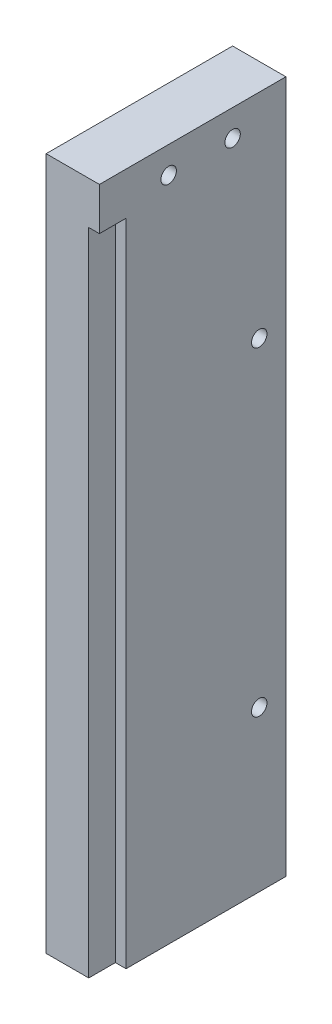
ISO-10303-21;
HEADER;
FILE_DESCRIPTION(('STEP AP214'),'2;1');
FILE_NAME('part.step','',(''),(''),'','','');
FILE_SCHEMA(('AUTOMOTIVE_DESIGN { 1 0 10303 214 1 1 1 1 }'));
ENDSEC;
DATA;
#1=APPLICATION_CONTEXT('core data for automotive mechanical design processes');
#2=APPLICATION_PROTOCOL_DEFINITION('international standard','automotive_design',2000,#1);
#3=PRODUCT_CONTEXT('',#1,'mechanical');
#4=PRODUCT('Part','Part','',(#3));
#5=PRODUCT_RELATED_PRODUCT_CATEGORY('part','',(#4));
#6=PRODUCT_DEFINITION_FORMATION('','',#4);
#7=PRODUCT_DEFINITION_CONTEXT('part definition',#1,'design');
#8=PRODUCT_DEFINITION('design','',#6,#7);
#9=PRODUCT_DEFINITION_SHAPE('','',#8);
#10=(LENGTH_UNIT() NAMED_UNIT(*) SI_UNIT(.MILLI.,.METRE.));
#11=(NAMED_UNIT(*) PLANE_ANGLE_UNIT() SI_UNIT($,.RADIAN.));
#12=(NAMED_UNIT(*) SI_UNIT($,.STERADIAN.) SOLID_ANGLE_UNIT());
#13=UNCERTAINTY_MEASURE_WITH_UNIT(LENGTH_MEASURE(1.E-05),#10,'distance_accuracy_value','');
#14=(GEOMETRIC_REPRESENTATION_CONTEXT(3) GLOBAL_UNCERTAINTY_ASSIGNED_CONTEXT((#13)) GLOBAL_UNIT_ASSIGNED_CONTEXT((#10,
#11,#12)) REPRESENTATION_CONTEXT('',''));
#15=CARTESIAN_POINT('',(0.,0.,0.));
#16=DIRECTION('',(0.,0.,1.));
#17=DIRECTION('',(1.,0.,0.));
#18=AXIS2_PLACEMENT_3D('',#15,#16,#17);
#19=CARTESIAN_POINT('',(-86.0171548528881,-65.3289844851904,-147.484048104053));
#20=DIRECTION('',(0.,-1.,0.));
#21=DIRECTION('',(0.,0.,-1.));
#22=AXIS2_PLACEMENT_3D('',#19,#20,#21);
#23=PLANE('',#22);
#24=CARTESIAN_POINT('',(-81.0171548528881,-65.3289844851904,4.90000000000004));
#25=DIRECTION('',(0.,-1.,0.));
#26=DIRECTION('',(0.,0.,-1.));
#27=AXIS2_PLACEMENT_3D('',#24,#25,#26);
#28=CIRCLE('',#27,2.1);
#29=CARTESIAN_POINT('',(-81.0171548528881,-65.3289844851904,2.80000000000004));
#30=VERTEX_POINT('',#29);
#31=EDGE_CURVE('E238',#30,#30,#28,.T.);
#32=ORIENTED_EDGE('',*,*,#31,.F.);
#33=EDGE_LOOP('',(#32));
#34=FACE_BOUND('',#33,.T.);
#35=CARTESIAN_POINT('',(-81.0171548528881,-65.3289844851904,-7.09999999999996));
#36=DIRECTION('',(0.,-1.,0.));
#37=DIRECTION('',(0.,0.,-1.));
#38=AXIS2_PLACEMENT_3D('',#35,#36,#37);
#39=CIRCLE('',#38,2.1);
#40=CARTESIAN_POINT('',(-81.0171548528881,-65.3289844851904,-9.19999999999997));
#41=VERTEX_POINT('',#40);
#42=EDGE_CURVE('E250',#41,#41,#39,.T.);
#43=ORIENTED_EDGE('',*,*,#42,.F.);
#44=EDGE_LOOP('',(#43));
#45=FACE_BOUND('',#44,.T.);
#46=DIRECTION('',(0.,0.,1.));
#47=VECTOR('',#46,1.);
#48=CARTESIAN_POINT('',(-76.0171548528881,-65.3289844851904,-147.484048104053));
#49=LINE('',#48,#47);
#50=CARTESIAN_POINT('',(-76.0171548528881,-65.3289844851904,-17.0999999999999));
#51=VERTEX_POINT('',#50);
#52=CARTESIAN_POINT('',(-76.0171548528881,-65.3289844851904,12.9));
#53=VERTEX_POINT('',#52);
#54=EDGE_CURVE('E186',#51,#53,#49,.T.);
#55=ORIENTED_EDGE('',*,*,#54,.T.);
#56=DIRECTION('',(-1.,0.,0.));
#57=VECTOR('',#56,1.);
#58=CARTESIAN_POINT('',(-86.0171548528881,-65.3289844851904,12.9));
#59=LINE('',#58,#57);
#60=CARTESIAN_POINT('',(-78.0171548528881,-65.3289844851904,12.9));
#61=VERTEX_POINT('',#60);
#62=EDGE_CURVE('E197',#53,#61,#59,.T.);
#63=ORIENTED_EDGE('',*,*,#62,.T.);
#64=DIRECTION('',(0.,0.,1.));
#65=VECTOR('',#64,1.);
#66=CARTESIAN_POINT('',(-78.0171548528881,-65.3289844851904,-147.484048104053));
#67=LINE('',#66,#65);
#68=CARTESIAN_POINT('',(-78.0171548528881,-65.3289844851904,17.9));
#69=VERTEX_POINT('',#68);
#70=EDGE_CURVE('E147',#61,#69,#67,.T.);
#71=ORIENTED_EDGE('',*,*,#70,.T.);
#72=DIRECTION('',(1.,0.,0.));
#73=VECTOR('',#72,1.);
#74=CARTESIAN_POINT('',(-86.0171548528881,-65.3289844851904,17.9));
#75=LINE('',#74,#73);
#76=CARTESIAN_POINT('',(-86.0171548528881,-65.3289844851904,17.9));
#77=VERTEX_POINT('',#76);
#78=EDGE_CURVE('E168',#77,#69,#75,.T.);
#79=ORIENTED_EDGE('',*,*,#78,.F.);
#80=DIRECTION('',(0.,0.,1.));
#81=VECTOR('',#80,1.);
#82=CARTESIAN_POINT('',(-86.0171548528881,-65.3289844851904,-147.484048104053));
#83=LINE('',#82,#81);
#84=CARTESIAN_POINT('',(-86.0171548528881,-65.3289844851904,-17.0999999999999));
#85=VERTEX_POINT('',#84);
#86=EDGE_CURVE('E179',#85,#77,#83,.T.);
#87=ORIENTED_EDGE('',*,*,#86,.F.);
#88=DIRECTION('',(-1.,0.,0.));
#89=VECTOR('',#88,1.);
#90=CARTESIAN_POINT('',(-86.0171548528881,-65.3289844851904,-17.0999999999999));
#91=LINE('',#90,#89);
#92=EDGE_CURVE('E164',#51,#85,#91,.T.);
#93=ORIENTED_EDGE('',*,*,#92,.F.);
#94=EDGE_LOOP('',(#55,#63,#71,#79,#87,#93));
#95=FACE_BOUND('',#94,.T.);
#96=ADVANCED_FACE('F41',(#34,#45,#95),#23,.T.);
#97=CARTESIAN_POINT('',(-86.0171548528881,64.6710155148096,-147.484048104053));
#98=DIRECTION('',(-1.,0.,0.));
#99=DIRECTION('',(0.,-1.,0.));
#100=AXIS2_PLACEMENT_3D('',#97,#98,#99);
#101=PLANE('',#100);
#102=CARTESIAN_POINT('',(-86.0171548528881,59.6710155148096,-7.09999999999996));
#103=DIRECTION('',(-1.,0.,0.));
#104=DIRECTION('',(0.,-1.,0.));
#105=AXIS2_PLACEMENT_3D('',#102,#103,#104);
#106=CIRCLE('',#105,2.475);
#107=CARTESIAN_POINT('',(-86.0171548528881,57.1960155148096,-7.09999999999996));
#108=VERTEX_POINT('',#107);
#109=EDGE_CURVE('E11',#108,#108,#106,.T.);
#110=ORIENTED_EDGE('',*,*,#109,.F.);
#111=EDGE_LOOP('',(#110));
#112=FACE_BOUND('',#111,.T.);
#113=CARTESIAN_POINT('',(-86.0171548528881,59.6710155148096,4.90000000000004));
#114=DIRECTION('',(-1.,0.,0.));
#115=DIRECTION('',(0.,-1.,0.));
#116=AXIS2_PLACEMENT_3D('',#113,#114,#115);
#117=CIRCLE('',#116,2.475);
#118=CARTESIAN_POINT('',(-86.0171548528881,57.1960155148096,4.90000000000004));
#119=VERTEX_POINT('',#118);
#120=EDGE_CURVE('E51',#119,#119,#117,.T.);
#121=ORIENTED_EDGE('',*,*,#120,.F.);
#122=EDGE_LOOP('',(#121));
#123=FACE_BOUND('',#122,.T.);
#124=CARTESIAN_POINT('',(-86.0171548528881,-35.3289844851904,-12.1));
#125=DIRECTION('',(-1.,0.,0.));
#126=DIRECTION('',(0.,-1.,0.));
#127=AXIS2_PLACEMENT_3D('',#124,#125,#126);
#128=CIRCLE('',#127,2.475);
#129=CARTESIAN_POINT('',(-86.0171548528881,-37.8039844851904,-12.1));
#130=VERTEX_POINT('',#129);
#131=EDGE_CURVE('E221',#130,#130,#128,.T.);
#132=ORIENTED_EDGE('',*,*,#131,.F.);
#133=EDGE_LOOP('',(#132));
#134=FACE_BOUND('',#133,.T.);
#135=CARTESIAN_POINT('',(-86.0171548528881,24.6710155148096,-12.1));
#136=DIRECTION('',(-1.,0.,0.));
#137=DIRECTION('',(0.,-1.,0.));
#138=AXIS2_PLACEMENT_3D('',#135,#136,#137);
#139=CIRCLE('',#138,2.475);
#140=CARTESIAN_POINT('',(-86.0171548528881,22.1960155148096,-12.1));
#141=VERTEX_POINT('',#140);
#142=EDGE_CURVE('E217',#141,#141,#139,.T.);
#143=ORIENTED_EDGE('',*,*,#142,.F.);
#144=EDGE_LOOP('',(#143));
#145=FACE_BOUND('',#144,.T.);
#146=DIRECTION('',(0.,1.,0.));
#147=VECTOR('',#146,1.);
#148=CARTESIAN_POINT('',(-86.0171548528881,64.6710155148096,-17.0999999999999));
#149=LINE('',#148,#147);
#150=CARTESIAN_POINT('',(-86.0171548528881,64.6710155148096,-17.0999999999999));
#151=VERTEX_POINT('',#150);
#152=EDGE_CURVE('E161',#85,#151,#149,.T.);
#153=ORIENTED_EDGE('',*,*,#152,.F.);
#154=ORIENTED_EDGE('',*,*,#86,.T.);
#155=DIRECTION('',(0.,-1.,0.));
#156=VECTOR('',#155,1.);
#157=CARTESIAN_POINT('',(-86.0171548528881,64.6710155148096,17.9));
#158=LINE('',#157,#156);
#159=CARTESIAN_POINT('',(-86.0171548528881,64.6710155148096,17.9));
#160=VERTEX_POINT('',#159);
#161=EDGE_CURVE('E154',#160,#77,#158,.T.);
#162=ORIENTED_EDGE('',*,*,#161,.F.);
#163=DIRECTION('',(0.,0.,1.));
#164=VECTOR('',#163,1.);
#165=CARTESIAN_POINT('',(-86.0171548528881,64.6710155148096,-147.484048104053));
#166=LINE('',#165,#164);
#167=EDGE_CURVE('E158',#151,#160,#166,.T.);
#168=ORIENTED_EDGE('',*,*,#167,.F.);
#169=EDGE_LOOP('',(#153,#154,#162,#168));
#170=FACE_BOUND('',#169,.T.);
#171=ADVANCED_FACE('F43',(#112,#123,#134,#145,#170),#101,.T.);
#172=CARTESIAN_POINT('',(-86.0171548528881,64.6710155148096,-147.484048104053));
#173=DIRECTION('',(0.,1.,0.));
#174=DIRECTION('',(0.,0.,1.));
#175=AXIS2_PLACEMENT_3D('',#172,#173,#174);
#176=PLANE('',#175);
#177=DIRECTION('',(1.,0.,0.));
#178=VECTOR('',#177,1.);
#179=CARTESIAN_POINT('',(-86.0171548528881,64.6710155148096,-17.0999999999999));
#180=LINE('',#179,#178);
#181=CARTESIAN_POINT('',(-76.0171548528881,64.6710155148096,-17.0999999999999));
#182=VERTEX_POINT('',#181);
#183=EDGE_CURVE('E68',#151,#182,#180,.T.);
#184=ORIENTED_EDGE('',*,*,#183,.F.);
#185=ORIENTED_EDGE('',*,*,#167,.T.);
#186=DIRECTION('',(-1.,0.,0.));
#187=VECTOR('',#186,1.);
#188=CARTESIAN_POINT('',(-86.0171548528881,64.6710155148096,17.9));
#189=LINE('',#188,#187);
#190=CARTESIAN_POINT('',(-76.0171548528881,64.6710155148096,17.9));
#191=VERTEX_POINT('',#190);
#192=EDGE_CURVE('E175',#191,#160,#189,.T.);
#193=ORIENTED_EDGE('',*,*,#192,.F.);
#194=DIRECTION('',(0.,0.,1.));
#195=VECTOR('',#194,1.);
#196=CARTESIAN_POINT('',(-76.0171548528881,64.6710155148096,-147.484048104053));
#197=LINE('',#196,#195);
#198=EDGE_CURVE('E182',#182,#191,#197,.T.);
#199=ORIENTED_EDGE('',*,*,#198,.F.);
#200=EDGE_LOOP('',(#184,#185,#193,#199));
#201=FACE_BOUND('',#200,.T.);
#202=ADVANCED_FACE('F291',(#201),#176,.T.);
#203=CARTESIAN_POINT('',(-76.0171548528881,64.6710155148096,-147.484048104053));
#204=DIRECTION('',(1.,0.,0.));
#205=DIRECTION('',(0.,1.,0.));
#206=AXIS2_PLACEMENT_3D('',#203,#204,#205);
#207=PLANE('',#206);
#208=DIRECTION('',(0.,-1.,0.));
#209=VECTOR('',#208,1.);
#210=CARTESIAN_POINT('',(-76.0171548528881,64.6710155148096,12.9));
#211=LINE('',#210,#209);
#212=CARTESIAN_POINT('',(-76.0171548528881,56.6710155148096,12.9));
#213=VERTEX_POINT('',#212);
#214=EDGE_CURVE('E151',#213,#53,#211,.T.);
#215=ORIENTED_EDGE('',*,*,#214,.T.);
#216=ORIENTED_EDGE('',*,*,#54,.F.);
#217=DIRECTION('',(0.,-1.,0.));
#218=VECTOR('',#217,1.);
#219=CARTESIAN_POINT('',(-76.0171548528881,64.6710155148096,-17.0999999999999));
#220=LINE('',#219,#218);
#221=EDGE_CURVE('E155',#182,#51,#220,.T.);
#222=ORIENTED_EDGE('',*,*,#221,.F.);
#223=ORIENTED_EDGE('',*,*,#198,.T.);
#224=DIRECTION('',(0.,1.,0.));
#225=VECTOR('',#224,1.);
#226=CARTESIAN_POINT('',(-76.0171548528881,64.6710155148096,17.9));
#227=LINE('',#226,#225);
#228=CARTESIAN_POINT('',(-76.0171548528881,56.6710155148096,17.9));
#229=VERTEX_POINT('',#228);
#230=EDGE_CURVE('E172',#229,#191,#227,.T.);
#231=ORIENTED_EDGE('',*,*,#230,.F.);
#232=DIRECTION('',(0.,0.,-1.));
#233=VECTOR('',#232,1.);
#234=CARTESIAN_POINT('',(-76.0171548528881,56.6710155148096,-147.484048104053));
#235=LINE('',#234,#233);
#236=EDGE_CURVE('E59',#229,#213,#235,.T.);
#237=ORIENTED_EDGE('',*,*,#236,.T.);
#238=EDGE_LOOP('',(#215,#216,#222,#223,#231,#237));
#239=FACE_BOUND('',#238,.T.);
#240=CARTESIAN_POINT('',(-76.0171548528881,59.6710155148096,-7.09999999999996));
#241=DIRECTION('',(1.,0.,0.));
#242=DIRECTION('',(0.,1.,0.));
#243=AXIS2_PLACEMENT_3D('',#240,#241,#242);
#244=CIRCLE('',#243,1.44999999999999);
#245=CARTESIAN_POINT('',(-76.0171548528881,61.1210155148096,-7.09999999999996));
#246=VERTEX_POINT('',#245);
#247=EDGE_CURVE('E213',#246,#246,#244,.T.);
#248=ORIENTED_EDGE('',*,*,#247,.F.);
#249=EDGE_LOOP('',(#248));
#250=FACE_BOUND('',#249,.T.);
#251=CARTESIAN_POINT('',(-76.0171548528881,59.6710155148096,4.90000000000004));
#252=DIRECTION('',(1.,0.,0.));
#253=DIRECTION('',(0.,1.,0.));
#254=AXIS2_PLACEMENT_3D('',#251,#252,#253);
#255=CIRCLE('',#254,1.44999999999999);
#256=CARTESIAN_POINT('',(-76.0171548528881,61.1210155148096,4.90000000000004));
#257=VERTEX_POINT('',#256);
#258=EDGE_CURVE('E209',#257,#257,#255,.T.);
#259=ORIENTED_EDGE('',*,*,#258,.F.);
#260=EDGE_LOOP('',(#259));
#261=FACE_BOUND('',#260,.T.);
#262=CARTESIAN_POINT('',(-76.0171548528881,-35.3289844851904,-12.1));
#263=DIRECTION('',(1.,0.,0.));
#264=DIRECTION('',(0.,1.,0.));
#265=AXIS2_PLACEMENT_3D('',#262,#263,#264);
#266=CIRCLE('',#265,1.45);
#267=CARTESIAN_POINT('',(-76.0171548528881,-33.8789844851904,-12.1));
#268=VERTEX_POINT('',#267);
#269=EDGE_CURVE('E205',#268,#268,#266,.T.);
#270=ORIENTED_EDGE('',*,*,#269,.F.);
#271=EDGE_LOOP('',(#270));
#272=FACE_BOUND('',#271,.T.);
#273=CARTESIAN_POINT('',(-76.0171548528881,24.6710155148096,-12.1));
#274=DIRECTION('',(1.,0.,0.));
#275=DIRECTION('',(0.,1.,0.));
#276=AXIS2_PLACEMENT_3D('',#273,#274,#275);
#277=CIRCLE('',#276,1.45);
#278=CARTESIAN_POINT('',(-76.0171548528881,26.1210155148096,-12.1));
#279=VERTEX_POINT('',#278);
#280=EDGE_CURVE('E201',#279,#279,#277,.T.);
#281=ORIENTED_EDGE('',*,*,#280,.F.);
#282=EDGE_LOOP('',(#281));
#283=FACE_BOUND('',#282,.T.);
#284=ADVANCED_FACE('F313',(#239,#250,#261,#272,#283),#207,.T.);
#285=CARTESIAN_POINT('',(0.,0.,17.9));
#286=DIRECTION('',(0.,0.,1.));
#287=DIRECTION('',(1.,0.,0.));
#288=AXIS2_PLACEMENT_3D('',#285,#286,#287);
#289=PLANE('',#288);
#290=ORIENTED_EDGE('',*,*,#78,.T.);
#291=DIRECTION('',(0.,-1.,0.));
#292=VECTOR('',#291,1.);
#293=CARTESIAN_POINT('',(-78.0171548528881,56.6710155148096,17.9));
#294=LINE('',#293,#292);
#295=CARTESIAN_POINT('',(-78.0171548528881,56.6710155148096,17.9));
#296=VERTEX_POINT('',#295);
#297=EDGE_CURVE('E132',#296,#69,#294,.T.);
#298=ORIENTED_EDGE('',*,*,#297,.F.);
#299=DIRECTION('',(1.,0.,0.));
#300=VECTOR('',#299,1.);
#301=CARTESIAN_POINT('',(0.,56.6710155148096,17.9));
#302=LINE('',#301,#300);
#303=EDGE_CURVE('E194',#296,#229,#302,.T.);
#304=ORIENTED_EDGE('',*,*,#303,.T.);
#305=ORIENTED_EDGE('',*,*,#230,.T.);
#306=ORIENTED_EDGE('',*,*,#192,.T.);
#307=ORIENTED_EDGE('',*,*,#161,.T.);
#308=EDGE_LOOP('',(#290,#298,#304,#305,#306,#307));
#309=FACE_BOUND('',#308,.T.);
#310=ADVANCED_FACE('F307',(#309),#289,.T.);
#311=CARTESIAN_POINT('',(-16.0171548528881,-5.32898448519041,-17.1));
#312=DIRECTION('',(0.,0.,1.));
#313=DIRECTION('',(1.,0.,0.));
#314=AXIS2_PLACEMENT_3D('',#311,#312,#313);
#315=PLANE('',#314);
#316=ORIENTED_EDGE('',*,*,#152,.T.);
#317=ORIENTED_EDGE('',*,*,#183,.T.);
#318=ORIENTED_EDGE('',*,*,#221,.T.);
#319=ORIENTED_EDGE('',*,*,#92,.T.);
#320=EDGE_LOOP('',(#316,#317,#318,#319));
#321=FACE_BOUND('',#320,.T.);
#322=ADVANCED_FACE('F316',(#321),#315,.F.);
#323=CARTESIAN_POINT('',(-78.0171548528881,56.6710155148096,17.9));
#324=DIRECTION('',(0.,-1.,0.));
#325=DIRECTION('',(1.,0.,0.));
#326=AXIS2_PLACEMENT_3D('',#323,#324,#325);
#327=PLANE('',#326);
#328=ORIENTED_EDGE('',*,*,#236,.F.);
#329=ORIENTED_EDGE('',*,*,#303,.F.);
#330=DIRECTION('',(0.,0.,-1.));
#331=VECTOR('',#330,1.);
#332=CARTESIAN_POINT('',(-78.0171548528881,56.6710155148096,17.9));
#333=LINE('',#332,#331);
#334=CARTESIAN_POINT('',(-78.0171548528881,56.6710155148096,12.9));
#335=VERTEX_POINT('',#334);
#336=EDGE_CURVE('E135',#296,#335,#333,.T.);
#337=ORIENTED_EDGE('',*,*,#336,.T.);
#338=DIRECTION('',(-1.,0.,0.));
#339=VECTOR('',#338,1.);
#340=CARTESIAN_POINT('',(-78.0171548528881,56.6710155148096,12.9));
#341=LINE('',#340,#339);
#342=EDGE_CURVE('E136',#213,#335,#341,.T.);
#343=ORIENTED_EDGE('',*,*,#342,.F.);
#344=EDGE_LOOP('',(#328,#329,#337,#343));
#345=FACE_BOUND('',#344,.T.);
#346=ADVANCED_FACE('F318',(#345),#327,.T.);
#347=CARTESIAN_POINT('',(-78.0171548528881,56.6710155148096,17.9));
#348=DIRECTION('',(1.,0.,0.));
#349=DIRECTION('',(0.,0.,-1.));
#350=AXIS2_PLACEMENT_3D('',#347,#348,#349);
#351=PLANE('',#350);
#352=ORIENTED_EDGE('',*,*,#70,.F.);
#353=DIRECTION('',(0.,-1.,0.));
#354=VECTOR('',#353,1.);
#355=CARTESIAN_POINT('',(-78.0171548528881,56.6710155148096,12.9));
#356=LINE('',#355,#354);
#357=EDGE_CURVE('E125',#335,#61,#356,.T.);
#358=ORIENTED_EDGE('',*,*,#357,.F.);
#359=ORIENTED_EDGE('',*,*,#336,.F.);
#360=ORIENTED_EDGE('',*,*,#297,.T.);
#361=EDGE_LOOP('',(#352,#358,#359,#360));
#362=FACE_BOUND('',#361,.T.);
#363=ADVANCED_FACE('F325',(#362),#351,.T.);
#364=CARTESIAN_POINT('',(-16.0171548528881,-5.32898448519041,12.9));
#365=DIRECTION('',(0.,0.,1.));
#366=DIRECTION('',(1.,0.,0.));
#367=AXIS2_PLACEMENT_3D('',#364,#365,#366);
#368=PLANE('',#367);
#369=ORIENTED_EDGE('',*,*,#214,.F.);
#370=ORIENTED_EDGE('',*,*,#342,.T.);
#371=ORIENTED_EDGE('',*,*,#357,.T.);
#372=ORIENTED_EDGE('',*,*,#62,.F.);
#373=EDGE_LOOP('',(#369,#370,#371,#372));
#374=FACE_BOUND('',#373,.T.);
#375=ADVANCED_FACE('F363',(#374),#368,.T.);
#376=CARTESIAN_POINT('',(-86.0171548528881,24.6710155148096,-12.1));
#377=DIRECTION('',(-1.,0.,0.));
#378=DIRECTION('',(0.,0.,1.));
#379=AXIS2_PLACEMENT_3D('',#376,#377,#378);
#380=CYLINDRICAL_SURFACE('',#379,2.475);
#381=CARTESIAN_POINT('',(-84.1171548528881,24.6710155148096,-12.1));
#382=DIRECTION('',(-1.,0.,0.));
#383=DIRECTION('',(0.,0.,1.));
#384=AXIS2_PLACEMENT_3D('',#381,#382,#383);
#385=CIRCLE('',#384,2.475);
#386=CARTESIAN_POINT('',(-84.1171548528881,24.6710155148096,-9.62499999999996));
#387=VERTEX_POINT('',#386);
#388=EDGE_CURVE('E236',#387,#387,#385,.T.);
#389=ORIENTED_EDGE('',*,*,#388,.F.);
#390=EDGE_LOOP('',(#389));
#391=FACE_BOUND('',#390,.T.);
#392=ORIENTED_EDGE('',*,*,#142,.T.);
#393=EDGE_LOOP('',(#392));
#394=FACE_BOUND('',#393,.T.);
#395=ADVANCED_FACE('F369',(#391,#394),#380,.F.);
#396=CARTESIAN_POINT('',(-84.1171548528881,26.1210155148096,-12.1));
#397=DIRECTION('',(1.,0.,0.));
#398=DIRECTION('',(0.,0.,-1.));
#399=AXIS2_PLACEMENT_3D('',#396,#397,#398);
#400=PLANE('',#399);
#401=CARTESIAN_POINT('',(-84.1171548528881,24.6710155148096,-12.1));
#402=DIRECTION('',(-1.,0.,0.));
#403=DIRECTION('',(0.,0.,1.));
#404=AXIS2_PLACEMENT_3D('',#401,#402,#403);
#405=CIRCLE('',#404,1.45);
#406=CARTESIAN_POINT('',(-84.1171548528881,24.6710155148096,-10.65));
#407=VERTEX_POINT('',#406);
#408=EDGE_CURVE('E257',#407,#407,#405,.T.);
#409=ORIENTED_EDGE('',*,*,#408,.F.);
#410=EDGE_LOOP('',(#409));
#411=FACE_BOUND('',#410,.T.);
#412=ORIENTED_EDGE('',*,*,#388,.T.);
#413=EDGE_LOOP('',(#412));
#414=FACE_BOUND('',#413,.T.);
#415=ADVANCED_FACE('F387',(#411,#414),#400,.F.);
#416=CARTESIAN_POINT('',(-86.0171548528881,24.6710155148096,-12.1));
#417=DIRECTION('',(-1.,0.,0.));
#418=DIRECTION('',(0.,0.,1.));
#419=AXIS2_PLACEMENT_3D('',#416,#417,#418);
#420=CYLINDRICAL_SURFACE('',#419,1.45);
#421=ORIENTED_EDGE('',*,*,#280,.T.);
#422=EDGE_LOOP('',(#421));
#423=FACE_BOUND('',#422,.T.);
#424=ORIENTED_EDGE('',*,*,#408,.T.);
#425=EDGE_LOOP('',(#424));
#426=FACE_BOUND('',#425,.T.);
#427=ADVANCED_FACE('F394',(#423,#426),#420,.F.);
#428=CARTESIAN_POINT('',(-86.0171548528881,-35.3289844851904,-12.1));
#429=DIRECTION('',(-1.,0.,0.));
#430=DIRECTION('',(0.,0.,1.));
#431=AXIS2_PLACEMENT_3D('',#428,#429,#430);
#432=CYLINDRICAL_SURFACE('',#431,2.475);
#433=CARTESIAN_POINT('',(-84.1171548528881,-35.3289844851904,-12.1));
#434=DIRECTION('',(-1.,0.,0.));
#435=DIRECTION('',(0.,0.,1.));
#436=AXIS2_PLACEMENT_3D('',#433,#434,#435);
#437=CIRCLE('',#436,2.475);
#438=CARTESIAN_POINT('',(-84.1171548528881,-35.3289844851904,-9.62499999999996));
#439=VERTEX_POINT('',#438);
#440=EDGE_CURVE('E261',#439,#439,#437,.T.);
#441=ORIENTED_EDGE('',*,*,#440,.F.);
#442=EDGE_LOOP('',(#441));
#443=FACE_BOUND('',#442,.T.);
#444=ORIENTED_EDGE('',*,*,#131,.T.);
#445=EDGE_LOOP('',(#444));
#446=FACE_BOUND('',#445,.T.);
#447=ADVANCED_FACE('F401',(#443,#446),#432,.F.);
#448=CARTESIAN_POINT('',(-84.1171548528881,-33.8789844851904,-12.1));
#449=DIRECTION('',(1.,0.,0.));
#450=DIRECTION('',(0.,0.,-1.));
#451=AXIS2_PLACEMENT_3D('',#448,#449,#450);
#452=PLANE('',#451);
#453=CARTESIAN_POINT('',(-84.1171548528881,-35.3289844851904,-12.1));
#454=DIRECTION('',(-1.,0.,0.));
#455=DIRECTION('',(0.,0.,1.));
#456=AXIS2_PLACEMENT_3D('',#453,#454,#455);
#457=CIRCLE('',#456,1.45);
#458=CARTESIAN_POINT('',(-84.1171548528881,-35.3289844851904,-10.65));
#459=VERTEX_POINT('',#458);
#460=EDGE_CURVE('E265',#459,#459,#457,.T.);
#461=ORIENTED_EDGE('',*,*,#460,.F.);
#462=EDGE_LOOP('',(#461));
#463=FACE_BOUND('',#462,.T.);
#464=ORIENTED_EDGE('',*,*,#440,.T.);
#465=EDGE_LOOP('',(#464));
#466=FACE_BOUND('',#465,.T.);
#467=ADVANCED_FACE('F408',(#463,#466),#452,.F.);
#468=CARTESIAN_POINT('',(-86.0171548528881,-35.3289844851904,-12.1));
#469=DIRECTION('',(-1.,0.,0.));
#470=DIRECTION('',(0.,0.,1.));
#471=AXIS2_PLACEMENT_3D('',#468,#469,#470);
#472=CYLINDRICAL_SURFACE('',#471,1.45);
#473=ORIENTED_EDGE('',*,*,#269,.T.);
#474=EDGE_LOOP('',(#473));
#475=FACE_BOUND('',#474,.T.);
#476=ORIENTED_EDGE('',*,*,#460,.T.);
#477=EDGE_LOOP('',(#476));
#478=FACE_BOUND('',#477,.T.);
#479=ADVANCED_FACE('F415',(#475,#478),#472,.F.);
#480=CARTESIAN_POINT('',(-86.0171548528881,59.6710155148096,4.90000000000004));
#481=DIRECTION('',(-1.,0.,0.));
#482=DIRECTION('',(0.,0.,1.));
#483=AXIS2_PLACEMENT_3D('',#480,#481,#482);
#484=CYLINDRICAL_SURFACE('',#483,2.475);
#485=CARTESIAN_POINT('',(-84.1171548528881,59.6710155148096,4.90000000000004));
#486=DIRECTION('',(-1.,0.,0.));
#487=DIRECTION('',(0.,0.,1.));
#488=AXIS2_PLACEMENT_3D('',#485,#486,#487);
#489=CIRCLE('',#488,2.475);
#490=CARTESIAN_POINT('',(-84.1171548528881,59.6710155148096,7.37500000000005));
#491=VERTEX_POINT('',#490);
#492=EDGE_CURVE('E269',#491,#491,#489,.T.);
#493=ORIENTED_EDGE('',*,*,#492,.F.);
#494=EDGE_LOOP('',(#493));
#495=FACE_BOUND('',#494,.T.);
#496=ORIENTED_EDGE('',*,*,#120,.T.);
#497=EDGE_LOOP('',(#496));
#498=FACE_BOUND('',#497,.T.);
#499=ADVANCED_FACE('F422',(#495,#498),#484,.F.);
#500=CARTESIAN_POINT('',(-84.1171548528881,61.1210155148096,4.90000000000004));
#501=DIRECTION('',(1.,0.,0.));
#502=DIRECTION('',(0.,0.,-1.));
#503=AXIS2_PLACEMENT_3D('',#500,#501,#502);
#504=PLANE('',#503);
#505=CARTESIAN_POINT('',(-84.1171548528881,59.6710155148096,4.90000000000004));
#506=DIRECTION('',(-1.,0.,0.));
#507=DIRECTION('',(0.,0.,1.));
#508=AXIS2_PLACEMENT_3D('',#505,#506,#507);
#509=CIRCLE('',#508,1.44999999999999);
#510=CARTESIAN_POINT('',(-84.1171548528881,59.6710155148096,6.35000000000003));
#511=VERTEX_POINT('',#510);
#512=EDGE_CURVE('E273',#511,#511,#509,.T.);
#513=ORIENTED_EDGE('',*,*,#512,.F.);
#514=EDGE_LOOP('',(#513));
#515=FACE_BOUND('',#514,.T.);
#516=ORIENTED_EDGE('',*,*,#492,.T.);
#517=EDGE_LOOP('',(#516));
#518=FACE_BOUND('',#517,.T.);
#519=ADVANCED_FACE('F429',(#515,#518),#504,.F.);
#520=CARTESIAN_POINT('',(-86.0171548528881,59.6710155148096,4.90000000000004));
#521=DIRECTION('',(-1.,0.,0.));
#522=DIRECTION('',(0.,0.,1.));
#523=AXIS2_PLACEMENT_3D('',#520,#521,#522);
#524=CYLINDRICAL_SURFACE('',#523,1.44999999999999);
#525=ORIENTED_EDGE('',*,*,#258,.T.);
#526=EDGE_LOOP('',(#525));
#527=FACE_BOUND('',#526,.T.);
#528=ORIENTED_EDGE('',*,*,#512,.T.);
#529=EDGE_LOOP('',(#528));
#530=FACE_BOUND('',#529,.T.);
#531=ADVANCED_FACE('F436',(#527,#530),#524,.F.);
#532=CARTESIAN_POINT('',(-86.0171548528881,59.6710155148096,-7.09999999999996));
#533=DIRECTION('',(-1.,0.,0.));
#534=DIRECTION('',(0.,0.,1.));
#535=AXIS2_PLACEMENT_3D('',#532,#533,#534);
#536=CYLINDRICAL_SURFACE('',#535,1.44999999999999);
#537=ORIENTED_EDGE('',*,*,#247,.T.);
#538=EDGE_LOOP('',(#537));
#539=FACE_BOUND('',#538,.T.);
#540=CARTESIAN_POINT('',(-84.1171548528881,59.6710155148096,-7.09999999999996));
#541=DIRECTION('',(-1.,0.,0.));
#542=DIRECTION('',(0.,0.,1.));
#543=AXIS2_PLACEMENT_3D('',#540,#541,#542);
#544=CIRCLE('',#543,1.44999999999999);
#545=CARTESIAN_POINT('',(-84.1171548528881,59.6710155148096,-5.64999999999997));
#546=VERTEX_POINT('',#545);
#547=EDGE_CURVE('E120',#546,#546,#544,.T.);
#548=ORIENTED_EDGE('',*,*,#547,.T.);
#549=EDGE_LOOP('',(#548));
#550=FACE_BOUND('',#549,.T.);
#551=ADVANCED_FACE('F443',(#539,#550),#536,.F.);
#552=CARTESIAN_POINT('',(-84.1171548528881,61.1210155148096,-7.09999999999996));
#553=DIRECTION('',(1.,0.,0.));
#554=DIRECTION('',(0.,0.,-1.));
#555=AXIS2_PLACEMENT_3D('',#552,#553,#554);
#556=PLANE('',#555);
#557=ORIENTED_EDGE('',*,*,#547,.F.);
#558=EDGE_LOOP('',(#557));
#559=FACE_BOUND('',#558,.T.);
#560=CARTESIAN_POINT('',(-84.1171548528881,59.6710155148096,-7.09999999999996));
#561=DIRECTION('',(-1.,0.,0.));
#562=DIRECTION('',(0.,0.,1.));
#563=AXIS2_PLACEMENT_3D('',#560,#561,#562);
#564=CIRCLE('',#563,2.475);
#565=CARTESIAN_POINT('',(-84.1171548528881,59.6710155148096,-4.62499999999995));
#566=VERTEX_POINT('',#565);
#567=EDGE_CURVE('E128',#566,#566,#564,.T.);
#568=ORIENTED_EDGE('',*,*,#567,.T.);
#569=EDGE_LOOP('',(#568));
#570=FACE_BOUND('',#569,.T.);
#571=ADVANCED_FACE('F280',(#559,#570),#556,.F.);
#572=CARTESIAN_POINT('',(-86.0171548528881,59.6710155148096,-7.09999999999996));
#573=DIRECTION('',(-1.,0.,0.));
#574=DIRECTION('',(0.,0.,1.));
#575=AXIS2_PLACEMENT_3D('',#572,#573,#574);
#576=CYLINDRICAL_SURFACE('',#575,2.475);
#577=ORIENTED_EDGE('',*,*,#567,.F.);
#578=EDGE_LOOP('',(#577));
#579=FACE_BOUND('',#578,.T.);
#580=ORIENTED_EDGE('',*,*,#109,.T.);
#581=EDGE_LOOP('',(#580));
#582=FACE_BOUND('',#581,.T.);
#583=ADVANCED_FACE('F282',(#579,#582),#576,.F.);
#584=CARTESIAN_POINT('',(-81.0171548528881,-58.8289844851904,4.90000000000004));
#585=DIRECTION('',(0.,-1.,0.));
#586=DIRECTION('',(0.,0.,-1.));
#587=AXIS2_PLACEMENT_3D('',#584,#585,#586);
#588=PLANE('',#587);
#589=CARTESIAN_POINT('',(-81.0171548528881,-58.8289844851904,4.90000000000004));
#590=DIRECTION('',(0.,-1.,0.));
#591=DIRECTION('',(0.,0.,-1.));
#592=AXIS2_PLACEMENT_3D('',#589,#590,#591);
#593=CIRCLE('',#592,2.1);
#594=CARTESIAN_POINT('',(-81.0171548528881,-58.8289844851904,2.80000000000004));
#595=VERTEX_POINT('',#594);
#596=EDGE_CURVE('E230',#595,#595,#593,.T.);
#597=ORIENTED_EDGE('',*,*,#596,.T.);
#598=EDGE_LOOP('',(#597));
#599=FACE_BOUND('',#598,.T.);
#600=CARTESIAN_POINT('',(-81.0171548528881,-58.8289844851904,4.90000000000004));
#601=DIRECTION('',(0.,-1.,0.));
#602=DIRECTION('',(0.,0.,-1.));
#603=AXIS2_PLACEMENT_3D('',#600,#601,#602);
#604=CIRCLE('',#603,1.44999999999999);
#605=CARTESIAN_POINT('',(-81.0171548528881,-58.8289844851904,3.45000000000005));
#606=VERTEX_POINT('',#605);
#607=EDGE_CURVE('E227',#606,#606,#604,.F.);
#608=ORIENTED_EDGE('',*,*,#607,.T.);
#609=EDGE_LOOP('',(#608));
#610=FACE_BOUND('',#609,.T.);
#611=ADVANCED_FACE('F285',(#599,#610),#588,.T.);
#612=CARTESIAN_POINT('',(-81.0171548528881,-58.8289844851904,4.90000000000004));
#613=DIRECTION('',(0.,-1.,0.));
#614=DIRECTION('',(0.,0.,-1.));
#615=AXIS2_PLACEMENT_3D('',#612,#613,#614);
#616=CYLINDRICAL_SURFACE('',#615,2.1);
#617=CARTESIAN_POINT('',(-81.0171548528881,-58.8289844851904,2.80000000000004));
#618=CARTESIAN_POINT('',(-81.0171548528881,-58.8966928185237,2.80000000000004));
#619=CARTESIAN_POINT('',(-81.0171548528881,-58.9644011518571,2.80000000000004));
#620=CARTESIAN_POINT('',(-81.0171548528881,-59.0998178185237,2.80000000000004));
#621=CARTESIAN_POINT('',(-81.0171548528881,-59.1675261518571,2.80000000000004));
#622=CARTESIAN_POINT('',(-81.0171548528881,-59.3029428185237,2.80000000000004));
#623=CARTESIAN_POINT('',(-81.0171548528881,-59.3706511518571,2.80000000000004));
#624=CARTESIAN_POINT('',(-81.0171548528881,-59.5060678185237,2.80000000000004));
#625=CARTESIAN_POINT('',(-81.0171548528881,-59.5737761518571,2.80000000000004));
#626=CARTESIAN_POINT('',(-81.0171548528881,-59.7091928185237,2.80000000000004));
#627=CARTESIAN_POINT('',(-81.0171548528881,-59.7769011518571,2.80000000000004));
#628=CARTESIAN_POINT('',(-81.0171548528881,-59.9123178185237,2.80000000000004));
#629=CARTESIAN_POINT('',(-81.0171548528881,-59.9800261518571,2.80000000000004));
#630=CARTESIAN_POINT('',(-81.0171548528881,-60.1154428185237,2.80000000000004));
#631=CARTESIAN_POINT('',(-81.0171548528881,-60.1831511518571,2.80000000000004));
#632=CARTESIAN_POINT('',(-81.0171548528881,-60.3185678185237,2.80000000000004));
#633=CARTESIAN_POINT('',(-81.0171548528881,-60.3862761518571,2.80000000000004));
#634=CARTESIAN_POINT('',(-81.0171548528881,-60.5216928185237,2.80000000000004));
#635=CARTESIAN_POINT('',(-81.0171548528881,-60.5894011518571,2.80000000000004));
#636=CARTESIAN_POINT('',(-81.0171548528881,-60.7248178185237,2.80000000000004));
#637=CARTESIAN_POINT('',(-81.0171548528881,-60.7925261518571,2.80000000000004));
#638=CARTESIAN_POINT('',(-81.0171548528881,-60.9279428185237,2.80000000000004));
#639=CARTESIAN_POINT('',(-81.0171548528881,-60.9956511518571,2.80000000000004));
#640=CARTESIAN_POINT('',(-81.0171548528881,-61.1310678185237,2.80000000000004));
#641=CARTESIAN_POINT('',(-81.0171548528881,-61.1987761518571,2.80000000000004));
#642=CARTESIAN_POINT('',(-81.0171548528881,-61.3341928185237,2.80000000000004));
#643=CARTESIAN_POINT('',(-81.0171548528881,-61.4019011518571,2.80000000000004));
#644=CARTESIAN_POINT('',(-81.0171548528881,-61.5373178185237,2.80000000000004));
#645=CARTESIAN_POINT('',(-81.0171548528881,-61.6050261518571,2.80000000000004));
#646=CARTESIAN_POINT('',(-81.0171548528881,-61.7404428185237,2.80000000000004));
#647=CARTESIAN_POINT('',(-81.0171548528881,-61.8081511518571,2.80000000000004));
#648=CARTESIAN_POINT('',(-81.0171548528881,-61.9435678185237,2.80000000000004));
#649=CARTESIAN_POINT('',(-81.0171548528881,-62.0112761518571,2.80000000000004));
#650=CARTESIAN_POINT('',(-81.0171548528881,-62.1466928185237,2.80000000000004));
#651=CARTESIAN_POINT('',(-81.0171548528881,-62.2144011518571,2.80000000000004));
#652=CARTESIAN_POINT('',(-81.0171548528881,-62.3498178185237,2.80000000000004));
#653=CARTESIAN_POINT('',(-81.0171548528881,-62.4175261518571,2.80000000000004));
#654=CARTESIAN_POINT('',(-81.0171548528881,-62.5529428185237,2.80000000000004));
#655=CARTESIAN_POINT('',(-81.0171548528881,-62.6206511518571,2.80000000000004));
#656=CARTESIAN_POINT('',(-81.0171548528881,-62.7560678185237,2.80000000000004));
#657=CARTESIAN_POINT('',(-81.0171548528881,-62.8237761518571,2.80000000000004));
#658=CARTESIAN_POINT('',(-81.0171548528881,-62.9591928185237,2.80000000000004));
#659=CARTESIAN_POINT('',(-81.0171548528881,-63.0269011518571,2.80000000000004));
#660=CARTESIAN_POINT('',(-81.0171548528881,-63.1623178185237,2.80000000000004));
#661=CARTESIAN_POINT('',(-81.0171548528881,-63.230026151857,2.80000000000004));
#662=CARTESIAN_POINT('',(-81.0171548528881,-63.3654428185237,2.80000000000004));
#663=CARTESIAN_POINT('',(-81.0171548528881,-63.433151151857,2.80000000000004));
#664=CARTESIAN_POINT('',(-81.0171548528881,-63.5685678185237,2.80000000000004));
#665=CARTESIAN_POINT('',(-81.0171548528881,-63.6362761518571,2.80000000000004));
#666=CARTESIAN_POINT('',(-81.0171548528881,-63.7716928185237,2.80000000000004));
#667=CARTESIAN_POINT('',(-81.0171548528881,-63.8394011518571,2.80000000000004));
#668=CARTESIAN_POINT('',(-81.0171548528881,-63.9748178185237,2.80000000000004));
#669=CARTESIAN_POINT('',(-81.0171548528881,-64.0425261518571,2.80000000000004));
#670=CARTESIAN_POINT('',(-81.0171548528881,-64.1779428185237,2.80000000000004));
#671=CARTESIAN_POINT('',(-81.0171548528881,-64.2456511518571,2.80000000000004));
#672=CARTESIAN_POINT('',(-81.0171548528881,-64.3810678185237,2.80000000000004));
#673=CARTESIAN_POINT('',(-81.0171548528881,-64.4487761518571,2.80000000000004));
#674=CARTESIAN_POINT('',(-81.0171548528881,-64.5841928185237,2.80000000000004));
#675=CARTESIAN_POINT('',(-81.0171548528881,-64.651901151857,2.80000000000004));
#676=CARTESIAN_POINT('',(-81.0171548528881,-64.7873178185237,2.80000000000004));
#677=CARTESIAN_POINT('',(-81.0171548528881,-64.855026151857,2.80000000000004));
#678=CARTESIAN_POINT('',(-81.0171548528881,-64.9904428185237,2.80000000000004));
#679=CARTESIAN_POINT('',(-81.0171548528881,-65.058151151857,2.80000000000004));
#680=CARTESIAN_POINT('',(-81.0171548528881,-65.1935678185237,2.80000000000004));
#681=CARTESIAN_POINT('',(-81.0171548528881,-65.261276151857,2.80000000000004));
#682=CARTESIAN_POINT('',(-81.0171548528881,-65.3289844851904,2.80000000000004));
#683=B_SPLINE_CURVE_WITH_KNOTS('',3,(#617,#618,#619,#620,#621,#622,#623,#624,#625,#626,#627,
#628,#629,#630,#631,#632,#633,#634,#635,#636,#637,#638,#639,#640,#641,#642,#643,#644,#645,#646,
#647,#648,#649,#650,#651,#652,#653,#654,#655,#656,#657,#658,#659,#660,#661,#662,#663,#664,#665,
#666,#667,#668,#669,#670,#671,#672,#673,#674,#675,#676,#677,#678,#679,#680,#681,#682),
.UNSPECIFIED.,.F.,.F.,(4,2,2,2,2,2,2,2,2,2,2,2,2,2,2,2,2,2,2,2,2,2,2,2,2,2,2,2,2,2,2,2,4),(0.,
0.203125000000005,0.406250000000004,0.609375000000002,0.812500000000001,1.015625,1.21875,
1.421875,1.625,1.828125,2.03125,2.234375,2.4375,2.640625,2.84375,3.046875,3.25,3.453125,3.65625,
3.859375,4.0625,4.26562499999999,4.46874999999999,4.67187499999999,4.875,5.078125,5.28125,
5.484375,5.6875,5.890625,6.09374999999999,6.29687499999999,6.49999999999999),.UNSPECIFIED.);
#684=EDGE_CURVE('BSEAM482',#595,#30,#683,.T.);
#685=ORIENTED_EDGE('',*,*,#596,.F.);
#686=ORIENTED_EDGE('',*,*,#31,.T.);
#687=ORIENTED_EDGE('',*,*,#684,.T.);
#688=ORIENTED_EDGE('',*,*,#684,.F.);
#689=EDGE_LOOP('',(#685,#687,#686,#688));
#690=FACE_BOUND('',#689,.T.);
#691=ADVANCED_FACE('F482',(#690),#616,.F.);
#692=CARTESIAN_POINT('',(-81.0171548528881,-58.8289844851904,-7.09999999999996));
#693=DIRECTION('',(0.,-1.,0.));
#694=DIRECTION('',(0.,0.,-1.));
#695=AXIS2_PLACEMENT_3D('',#692,#693,#694);
#696=PLANE('',#695);
#697=CARTESIAN_POINT('',(-81.0171548528881,-58.8289844851904,-7.09999999999996));
#698=DIRECTION('',(0.,-1.,0.));
#699=DIRECTION('',(0.,0.,-1.));
#700=AXIS2_PLACEMENT_3D('',#697,#698,#699);
#701=CIRCLE('',#700,2.1);
#702=CARTESIAN_POINT('',(-81.0171548528881,-58.8289844851904,-9.19999999999997));
#703=VERTEX_POINT('',#702);
#704=EDGE_CURVE('E244',#703,#703,#701,.T.);
#705=ORIENTED_EDGE('',*,*,#704,.T.);
#706=EDGE_LOOP('',(#705));
#707=FACE_BOUND('',#706,.T.);
#708=CARTESIAN_POINT('',(-81.0171548528881,-58.8289844851904,-7.09999999999996));
#709=DIRECTION('',(0.,-1.,0.));
#710=DIRECTION('',(0.,0.,-1.));
#711=AXIS2_PLACEMENT_3D('',#708,#709,#710);
#712=CIRCLE('',#711,1.44999999999999);
#713=CARTESIAN_POINT('',(-81.0171548528881,-58.8289844851904,-8.54999999999995));
#714=VERTEX_POINT('',#713);
#715=EDGE_CURVE('E45',#714,#714,#712,.F.);
#716=ORIENTED_EDGE('',*,*,#715,.T.);
#717=EDGE_LOOP('',(#716));
#718=FACE_BOUND('',#717,.T.);
#719=ADVANCED_FACE('F490',(#707,#718),#696,.T.);
#720=CARTESIAN_POINT('',(-81.0171548528881,-58.8289844851904,-7.09999999999996));
#721=DIRECTION('',(0.,-1.,0.));
#722=DIRECTION('',(0.,0.,-1.));
#723=AXIS2_PLACEMENT_3D('',#720,#721,#722);
#724=CYLINDRICAL_SURFACE('',#723,2.1);
#725=CARTESIAN_POINT('',(-81.0171548528881,-58.8289844851904,-9.19999999999997));
#726=CARTESIAN_POINT('',(-81.0171548528881,-58.8966928185237,-9.19999999999997));
#727=CARTESIAN_POINT('',(-81.0171548528881,-58.9644011518571,-9.19999999999997));
#728=CARTESIAN_POINT('',(-81.0171548528881,-59.0998178185237,-9.19999999999997));
#729=CARTESIAN_POINT('',(-81.0171548528881,-59.1675261518571,-9.19999999999997));
#730=CARTESIAN_POINT('',(-81.0171548528881,-59.3029428185237,-9.19999999999997));
#731=CARTESIAN_POINT('',(-81.0171548528881,-59.3706511518571,-9.19999999999997));
#732=CARTESIAN_POINT('',(-81.0171548528881,-59.5060678185237,-9.19999999999997));
#733=CARTESIAN_POINT('',(-81.0171548528881,-59.5737761518571,-9.19999999999997));
#734=CARTESIAN_POINT('',(-81.0171548528881,-59.7091928185237,-9.19999999999997));
#735=CARTESIAN_POINT('',(-81.0171548528881,-59.7769011518571,-9.19999999999997));
#736=CARTESIAN_POINT('',(-81.0171548528881,-59.9123178185237,-9.19999999999997));
#737=CARTESIAN_POINT('',(-81.0171548528881,-59.9800261518571,-9.19999999999997));
#738=CARTESIAN_POINT('',(-81.0171548528881,-60.1154428185237,-9.19999999999997));
#739=CARTESIAN_POINT('',(-81.0171548528881,-60.1831511518571,-9.19999999999997));
#740=CARTESIAN_POINT('',(-81.0171548528881,-60.3185678185237,-9.19999999999997));
#741=CARTESIAN_POINT('',(-81.0171548528881,-60.3862761518571,-9.19999999999997));
#742=CARTESIAN_POINT('',(-81.0171548528881,-60.5216928185237,-9.19999999999997));
#743=CARTESIAN_POINT('',(-81.0171548528881,-60.5894011518571,-9.19999999999997));
#744=CARTESIAN_POINT('',(-81.0171548528881,-60.7248178185237,-9.19999999999997));
#745=CARTESIAN_POINT('',(-81.0171548528881,-60.7925261518571,-9.19999999999997));
#746=CARTESIAN_POINT('',(-81.0171548528881,-60.9279428185237,-9.19999999999997));
#747=CARTESIAN_POINT('',(-81.0171548528881,-60.9956511518571,-9.19999999999997));
#748=CARTESIAN_POINT('',(-81.0171548528881,-61.1310678185237,-9.19999999999997));
#749=CARTESIAN_POINT('',(-81.0171548528881,-61.1987761518571,-9.19999999999997));
#750=CARTESIAN_POINT('',(-81.0171548528881,-61.3341928185237,-9.19999999999997));
#751=CARTESIAN_POINT('',(-81.0171548528881,-61.4019011518571,-9.19999999999997));
#752=CARTESIAN_POINT('',(-81.0171548528881,-61.5373178185237,-9.19999999999997));
#753=CARTESIAN_POINT('',(-81.0171548528881,-61.6050261518571,-9.19999999999997));
#754=CARTESIAN_POINT('',(-81.0171548528881,-61.7404428185237,-9.19999999999997));
#755=CARTESIAN_POINT('',(-81.0171548528881,-61.8081511518571,-9.19999999999997));
#756=CARTESIAN_POINT('',(-81.0171548528881,-61.9435678185237,-9.19999999999997));
#757=CARTESIAN_POINT('',(-81.0171548528881,-62.0112761518571,-9.19999999999997));
#758=CARTESIAN_POINT('',(-81.0171548528881,-62.1466928185237,-9.19999999999997));
#759=CARTESIAN_POINT('',(-81.0171548528881,-62.2144011518571,-9.19999999999997));
#760=CARTESIAN_POINT('',(-81.0171548528881,-62.3498178185237,-9.19999999999997));
#761=CARTESIAN_POINT('',(-81.0171548528881,-62.4175261518571,-9.19999999999997));
#762=CARTESIAN_POINT('',(-81.0171548528881,-62.5529428185237,-9.19999999999997));
#763=CARTESIAN_POINT('',(-81.0171548528881,-62.6206511518571,-9.19999999999997));
#764=CARTESIAN_POINT('',(-81.0171548528881,-62.7560678185237,-9.19999999999997));
#765=CARTESIAN_POINT('',(-81.0171548528881,-62.8237761518571,-9.19999999999997));
#766=CARTESIAN_POINT('',(-81.0171548528881,-62.9591928185237,-9.19999999999997));
#767=CARTESIAN_POINT('',(-81.0171548528881,-63.0269011518571,-9.19999999999997));
#768=CARTESIAN_POINT('',(-81.0171548528881,-63.1623178185237,-9.19999999999997));
#769=CARTESIAN_POINT('',(-81.0171548528881,-63.230026151857,-9.19999999999997));
#770=CARTESIAN_POINT('',(-81.0171548528881,-63.3654428185237,-9.19999999999997));
#771=CARTESIAN_POINT('',(-81.0171548528881,-63.433151151857,-9.19999999999997));
#772=CARTESIAN_POINT('',(-81.0171548528881,-63.5685678185237,-9.19999999999997));
#773=CARTESIAN_POINT('',(-81.0171548528881,-63.6362761518571,-9.19999999999997));
#774=CARTESIAN_POINT('',(-81.0171548528881,-63.7716928185237,-9.19999999999997));
#775=CARTESIAN_POINT('',(-81.0171548528881,-63.8394011518571,-9.19999999999997));
#776=CARTESIAN_POINT('',(-81.0171548528881,-63.9748178185237,-9.19999999999997));
#777=CARTESIAN_POINT('',(-81.0171548528881,-64.0425261518571,-9.19999999999997));
#778=CARTESIAN_POINT('',(-81.0171548528881,-64.1779428185237,-9.19999999999997));
#779=CARTESIAN_POINT('',(-81.0171548528881,-64.2456511518571,-9.19999999999997));
#780=CARTESIAN_POINT('',(-81.0171548528881,-64.3810678185237,-9.19999999999997));
#781=CARTESIAN_POINT('',(-81.0171548528881,-64.4487761518571,-9.19999999999997));
#782=CARTESIAN_POINT('',(-81.0171548528881,-64.5841928185237,-9.19999999999997));
#783=CARTESIAN_POINT('',(-81.0171548528881,-64.651901151857,-9.19999999999997));
#784=CARTESIAN_POINT('',(-81.0171548528881,-64.7873178185237,-9.19999999999997));
#785=CARTESIAN_POINT('',(-81.0171548528881,-64.855026151857,-9.19999999999997));
#786=CARTESIAN_POINT('',(-81.0171548528881,-64.9904428185237,-9.19999999999997));
#787=CARTESIAN_POINT('',(-81.0171548528881,-65.058151151857,-9.19999999999997));
#788=CARTESIAN_POINT('',(-81.0171548528881,-65.1935678185237,-9.19999999999997));
#789=CARTESIAN_POINT('',(-81.0171548528881,-65.261276151857,-9.19999999999997));
#790=CARTESIAN_POINT('',(-81.0171548528881,-65.3289844851904,-9.19999999999997));
#791=B_SPLINE_CURVE_WITH_KNOTS('',3,(#725,#726,#727,#728,#729,#730,#731,#732,#733,#734,#735,
#736,#737,#738,#739,#740,#741,#742,#743,#744,#745,#746,#747,#748,#749,#750,#751,#752,#753,#754,
#755,#756,#757,#758,#759,#760,#761,#762,#763,#764,#765,#766,#767,#768,#769,#770,#771,#772,#773,
#774,#775,#776,#777,#778,#779,#780,#781,#782,#783,#784,#785,#786,#787,#788,#789,#790),
.UNSPECIFIED.,.F.,.F.,(4,2,2,2,2,2,2,2,2,2,2,2,2,2,2,2,2,2,2,2,2,2,2,2,2,2,2,2,2,2,2,2,4),(0.,
0.203125000000005,0.406250000000004,0.609375000000002,0.812500000000001,1.015625,1.21875,
1.421875,1.625,1.828125,2.03125,2.234375,2.4375,2.640625,2.84375,3.046875,3.25,3.453125,3.65625,
3.859375,4.0625,4.26562499999999,4.46874999999999,4.67187499999999,4.875,5.078125,5.28125,
5.484375,5.6875,5.890625,6.09374999999999,6.29687499999999,6.49999999999999),.UNSPECIFIED.);
#792=EDGE_CURVE('BSEAM380',#703,#41,#791,.T.);
#793=ORIENTED_EDGE('',*,*,#704,.F.);
#794=ORIENTED_EDGE('',*,*,#42,.T.);
#795=ORIENTED_EDGE('',*,*,#792,.T.);
#796=ORIENTED_EDGE('',*,*,#792,.F.);
#797=EDGE_LOOP('',(#793,#795,#794,#796));
#798=FACE_BOUND('',#797,.T.);
#799=ADVANCED_FACE('F380',(#798),#724,.F.);
#800=CARTESIAN_POINT('',(-81.0171548528881,-55.3289844851904,4.90000000000004));
#801=DIRECTION('',(0.,-1.,0.));
#802=DIRECTION('',(0.,0.,-1.));
#803=AXIS2_PLACEMENT_3D('',#800,#801,#802);
#804=CONICAL_SURFACE('',#803,1.44999999999999,1.02974425867665);
#805=CARTESIAN_POINT('',(-81.0171548528881,-54.4577365876005,4.90000000000004));
#806=VERTEX_POINT('',#805);
#807=VERTEX_LOOP('',#806);
#808=FACE_BOUND('',#807,.T.);
#809=CARTESIAN_POINT('',(-81.0171548528881,-55.3289844851904,4.90000000000004));
#810=DIRECTION('',(0.,-1.,0.));
#811=DIRECTION('',(0.,0.,-1.));
#812=AXIS2_PLACEMENT_3D('',#809,#810,#811);
#813=CIRCLE('',#812,1.44999999999999);
#814=CARTESIAN_POINT('',(-81.0171548528881,-55.3289844851904,3.45000000000005));
#815=VERTEX_POINT('',#814);
#816=EDGE_CURVE('E119',#815,#815,#813,.T.);
#817=ORIENTED_EDGE('',*,*,#816,.T.);
#818=EDGE_LOOP('',(#817));
#819=FACE_BOUND('',#818,.T.);
#820=ADVANCED_FACE('F378',(#808,#819),#804,.F.);
#821=CARTESIAN_POINT('',(-81.0171548528881,-75.3289844851904,4.90000000000004));
#822=DIRECTION('',(0.,-1.,0.));
#823=DIRECTION('',(0.,0.,-1.));
#824=AXIS2_PLACEMENT_3D('',#821,#822,#823);
#825=CYLINDRICAL_SURFACE('',#824,1.44999999999999);
#826=ORIENTED_EDGE('',*,*,#816,.F.);
#827=EDGE_LOOP('',(#826));
#828=FACE_BOUND('',#827,.T.);
#829=ORIENTED_EDGE('',*,*,#607,.F.);
#830=EDGE_LOOP('',(#829));
#831=FACE_BOUND('',#830,.T.);
#832=ADVANCED_FACE('F112',(#828,#831),#825,.F.);
#833=CARTESIAN_POINT('',(-81.0171548528881,-55.3289844851904,-7.09999999999996));
#834=DIRECTION('',(0.,-1.,0.));
#835=DIRECTION('',(0.,0.,-1.));
#836=AXIS2_PLACEMENT_3D('',#833,#834,#835);
#837=CONICAL_SURFACE('',#836,1.44999999999999,1.02974425867665);
#838=CARTESIAN_POINT('',(-81.0171548528881,-54.4577365876005,-7.09999999999996));
#839=VERTEX_POINT('',#838);
#840=VERTEX_LOOP('',#839);
#841=FACE_BOUND('',#840,.T.);
#842=CARTESIAN_POINT('',(-81.0171548528881,-55.3289844851904,-7.09999999999996));
#843=DIRECTION('',(0.,-1.,0.));
#844=DIRECTION('',(0.,0.,-1.));
#845=AXIS2_PLACEMENT_3D('',#842,#843,#844);
#846=CIRCLE('',#845,1.44999999999999);
#847=CARTESIAN_POINT('',(-81.0171548528881,-55.3289844851904,-8.54999999999995));
#848=VERTEX_POINT('',#847);
#849=EDGE_CURVE('E116',#848,#848,#846,.T.);
#850=ORIENTED_EDGE('',*,*,#849,.T.);
#851=EDGE_LOOP('',(#850));
#852=FACE_BOUND('',#851,.T.);
#853=ADVANCED_FACE('F108',(#841,#852),#837,.F.);
#854=CARTESIAN_POINT('',(-81.0171548528881,-75.3289844851904,-7.09999999999996));
#855=DIRECTION('',(0.,-1.,0.));
#856=DIRECTION('',(0.,0.,-1.));
#857=AXIS2_PLACEMENT_3D('',#854,#855,#856);
#858=CYLINDRICAL_SURFACE('',#857,1.44999999999999);
#859=ORIENTED_EDGE('',*,*,#849,.F.);
#860=EDGE_LOOP('',(#859));
#861=FACE_BOUND('',#860,.T.);
#862=ORIENTED_EDGE('',*,*,#715,.F.);
#863=EDGE_LOOP('',(#862));
#864=FACE_BOUND('',#863,.T.);
#865=ADVANCED_FACE('F111',(#861,#864),#858,.F.);
#866=CLOSED_SHELL('',(#96,#171,#202,#284,#310,#322,#346,#363,#375,#395,#415,#427,#447,#467,#479,
#499,#519,#531,#551,#571,#583,#611,#691,#719,#799,#820,#832,#853,#865));
#867=MANIFOLD_SOLID_BREP('B2',#866);
#868=ADVANCED_BREP_SHAPE_REPRESENTATION('',(#18,#867),#14);
#869=SHAPE_DEFINITION_REPRESENTATION(#9,#868);
ENDSEC;
END-ISO-10303-21;
